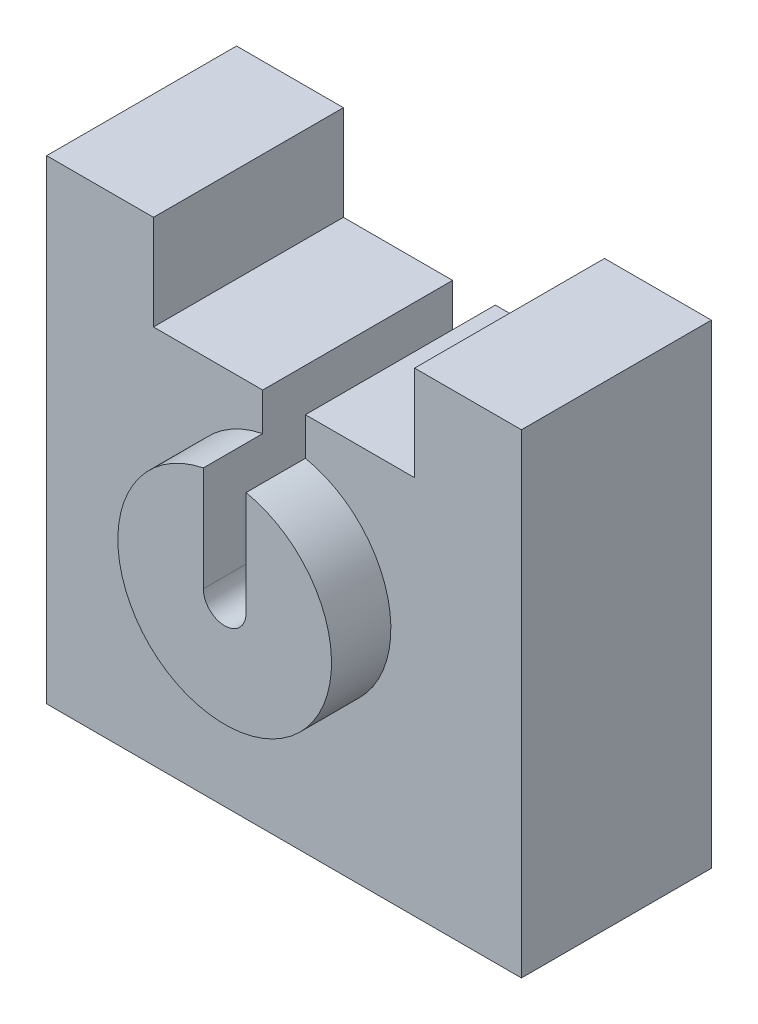
ISO-10303-21;
HEADER;
FILE_DESCRIPTION(('STEP AP214'),'2;1');
FILE_NAME('part.step','',(''),(''),'','','');
FILE_SCHEMA(('AUTOMOTIVE_DESIGN { 1 0 10303 214 1 1 1 1 }'));
ENDSEC;
DATA;
#1=APPLICATION_CONTEXT('core data for automotive mechanical design processes');
#2=APPLICATION_PROTOCOL_DEFINITION('international standard','automotive_design',2000,#1);
#3=PRODUCT_CONTEXT('',#1,'mechanical');
#4=PRODUCT('Part','Part','',(#3));
#5=PRODUCT_RELATED_PRODUCT_CATEGORY('part','',(#4));
#6=PRODUCT_DEFINITION_FORMATION('','',#4);
#7=PRODUCT_DEFINITION_CONTEXT('part definition',#1,'design');
#8=PRODUCT_DEFINITION('design','',#6,#7);
#9=PRODUCT_DEFINITION_SHAPE('','',#8);
#10=(LENGTH_UNIT() NAMED_UNIT(*) SI_UNIT(.MILLI.,.METRE.));
#11=(NAMED_UNIT(*) PLANE_ANGLE_UNIT() SI_UNIT($,.RADIAN.));
#12=(NAMED_UNIT(*) SI_UNIT($,.STERADIAN.) SOLID_ANGLE_UNIT());
#13=UNCERTAINTY_MEASURE_WITH_UNIT(LENGTH_MEASURE(1.E-05),#10,'distance_accuracy_value','');
#14=(GEOMETRIC_REPRESENTATION_CONTEXT(3) GLOBAL_UNCERTAINTY_ASSIGNED_CONTEXT((#13)) GLOBAL_UNIT_ASSIGNED_CONTEXT((#10,
#11,#12)) REPRESENTATION_CONTEXT('',''));
#15=CARTESIAN_POINT('',(0.,0.,0.));
#16=DIRECTION('',(0.,0.,1.));
#17=DIRECTION('',(1.,0.,0.));
#18=AXIS2_PLACEMENT_3D('',#15,#16,#17);
#19=CARTESIAN_POINT('',(0.275,0.3,0.4));
#20=DIRECTION('',(0.,-1.,0.));
#21=DIRECTION('',(1.,0.,0.));
#22=AXIS2_PLACEMENT_3D('',#19,#20,#21);
#23=PLANE('',#22);
#24=DIRECTION('',(-1.,0.,0.));
#25=VECTOR('',#24,1.);
#26=CARTESIAN_POINT('',(0.275,0.3,0.4));
#27=LINE('',#26,#25);
#28=CARTESIAN_POINT('',(-0.045,0.3,0.4));
#29=VERTEX_POINT('',#28);
#30=CARTESIAN_POINT('',(-0.275,0.3,0.4));
#31=VERTEX_POINT('',#30);
#32=EDGE_CURVE('E170',#29,#31,#27,.T.);
#33=ORIENTED_EDGE('',*,*,#32,.F.);
#34=DIRECTION('',(0.,0.,-1.));
#35=VECTOR('',#34,1.);
#36=CARTESIAN_POINT('',(-0.045,0.3,0.4));
#37=LINE('',#36,#35);
#38=CARTESIAN_POINT('',(-0.045,0.3,0.));
#39=VERTEX_POINT('',#38);
#40=EDGE_CURVE('E154',#29,#39,#37,.T.);
#41=ORIENTED_EDGE('',*,*,#40,.T.);
#42=DIRECTION('',(-1.,0.,0.));
#43=VECTOR('',#42,1.);
#44=CARTESIAN_POINT('',(0.275,0.3,0.));
#45=LINE('',#44,#43);
#46=CARTESIAN_POINT('',(-0.275,0.3,0.));
#47=VERTEX_POINT('',#46);
#48=EDGE_CURVE('E189',#39,#47,#45,.T.);
#49=ORIENTED_EDGE('',*,*,#48,.T.);
#50=DIRECTION('',(0.,0.,-1.));
#51=VECTOR('',#50,1.);
#52=CARTESIAN_POINT('',(-0.275,0.3,0.4));
#53=LINE('',#52,#51);
#54=EDGE_CURVE('E211',#31,#47,#53,.T.);
#55=ORIENTED_EDGE('',*,*,#54,.F.);
#56=EDGE_LOOP('',(#33,#41,#49,#55));
#57=FACE_BOUND('',#56,.T.);
#58=ADVANCED_FACE('F32',(#57),#23,.F.);
#59=CARTESIAN_POINT('',(0.,0.,0.));
#60=DIRECTION('',(0.,0.,-1.));
#61=DIRECTION('',(-1.,0.,0.));
#62=AXIS2_PLACEMENT_3D('',#59,#60,#61);
#63=PLANE('',#62);
#64=DIRECTION('',(0.,1.,0.));
#65=VECTOR('',#64,1.);
#66=CARTESIAN_POINT('',(-0.045,0.,0.));
#67=LINE('',#66,#65);
#68=CARTESIAN_POINT('',(-0.045,0.,0.));
#69=VERTEX_POINT('',#68);
#70=EDGE_CURVE('E279',#69,#39,#67,.T.);
#71=ORIENTED_EDGE('',*,*,#70,.F.);
#72=CARTESIAN_POINT('',(0.,0.,0.));
#73=DIRECTION('',(0.,0.,1.));
#74=DIRECTION('',(1.,0.,0.));
#75=AXIS2_PLACEMENT_3D('',#72,#73,#74);
#76=CIRCLE('',#75,0.045);
#77=CARTESIAN_POINT('',(0.045,0.,0.));
#78=VERTEX_POINT('',#77);
#79=EDGE_CURVE('E150',#69,#78,#76,.T.);
#80=ORIENTED_EDGE('',*,*,#79,.T.);
#81=DIRECTION('',(0.,-1.,0.));
#82=VECTOR('',#81,1.);
#83=CARTESIAN_POINT('',(0.045,0.,0.));
#84=LINE('',#83,#82);
#85=CARTESIAN_POINT('',(0.045,0.3,0.));
#86=VERTEX_POINT('',#85);
#87=EDGE_CURVE('E47',#86,#78,#84,.T.);
#88=ORIENTED_EDGE('',*,*,#87,.F.);
#89=CARTESIAN_POINT('',(0.275,0.3,0.));
#90=VERTEX_POINT('',#89);
#91=EDGE_CURVE('E190',#90,#86,#45,.T.);
#92=ORIENTED_EDGE('',*,*,#91,.F.);
#93=DIRECTION('',(0.,-1.,0.));
#94=VECTOR('',#93,1.);
#95=CARTESIAN_POINT('',(0.275,0.5,0.));
#96=LINE('',#95,#94);
#97=CARTESIAN_POINT('',(0.275,0.5,0.));
#98=VERTEX_POINT('',#97);
#99=EDGE_CURVE('E187',#98,#90,#96,.T.);
#100=ORIENTED_EDGE('',*,*,#99,.F.);
#101=DIRECTION('',(-1.,0.,0.));
#102=VECTOR('',#101,1.);
#103=CARTESIAN_POINT('',(0.275,0.5,0.));
#104=LINE('',#103,#102);
#105=CARTESIAN_POINT('',(0.5,0.5,0.));
#106=VERTEX_POINT('',#105);
#107=EDGE_CURVE('E185',#106,#98,#104,.T.);
#108=ORIENTED_EDGE('',*,*,#107,.F.);
#109=DIRECTION('',(0.,1.,0.));
#110=VECTOR('',#109,1.);
#111=CARTESIAN_POINT('',(0.5,-0.5,0.));
#112=LINE('',#111,#110);
#113=CARTESIAN_POINT('',(0.5,-0.5,0.));
#114=VERTEX_POINT('',#113);
#115=EDGE_CURVE('E161',#114,#106,#112,.T.);
#116=ORIENTED_EDGE('',*,*,#115,.F.);
#117=DIRECTION('',(1.,0.,0.));
#118=VECTOR('',#117,1.);
#119=CARTESIAN_POINT('',(-0.5,-0.5,0.));
#120=LINE('',#119,#118);
#121=CARTESIAN_POINT('',(-0.5,-0.5,0.));
#122=VERTEX_POINT('',#121);
#123=EDGE_CURVE('E166',#122,#114,#120,.T.);
#124=ORIENTED_EDGE('',*,*,#123,.F.);
#125=DIRECTION('',(0.,-1.,0.));
#126=VECTOR('',#125,1.);
#127=CARTESIAN_POINT('',(-0.5,-0.5,0.));
#128=LINE('',#127,#126);
#129=CARTESIAN_POINT('',(-0.5,0.5,0.));
#130=VERTEX_POINT('',#129);
#131=EDGE_CURVE('E197',#130,#122,#128,.T.);
#132=ORIENTED_EDGE('',*,*,#131,.F.);
#133=DIRECTION('',(-1.,0.,0.));
#134=VECTOR('',#133,1.);
#135=CARTESIAN_POINT('',(-0.5,0.5,0.));
#136=LINE('',#135,#134);
#137=CARTESIAN_POINT('',(-0.275,0.5,0.));
#138=VERTEX_POINT('',#137);
#139=EDGE_CURVE('E195',#138,#130,#136,.T.);
#140=ORIENTED_EDGE('',*,*,#139,.F.);
#141=DIRECTION('',(0.,1.,0.));
#142=VECTOR('',#141,1.);
#143=CARTESIAN_POINT('',(-0.275,0.5,0.));
#144=LINE('',#143,#142);
#145=EDGE_CURVE('E193',#47,#138,#144,.T.);
#146=ORIENTED_EDGE('',*,*,#145,.F.);
#147=ORIENTED_EDGE('',*,*,#48,.F.);
#148=EDGE_LOOP('',(#71,#80,#88,#92,#100,#108,#116,#124,#132,#140,#146,#147));
#149=FACE_BOUND('',#148,.T.);
#150=ADVANCED_FACE('F227',(#149),#63,.T.);
#151=CARTESIAN_POINT('',(0.,0.,0.525));
#152=DIRECTION('',(0.,0.,-1.));
#153=DIRECTION('',(-1.,0.,0.));
#154=AXIS2_PLACEMENT_3D('',#151,#152,#153);
#155=PLANE('',#154);
#156=CARTESIAN_POINT('',(0.,0.,0.525));
#157=DIRECTION('',(0.,0.,1.));
#158=DIRECTION('',(1.,0.,0.));
#159=AXIS2_PLACEMENT_3D('',#156,#157,#158);
#160=CIRCLE('',#159,0.045);
#161=CARTESIAN_POINT('',(-0.045,0.,0.525));
#162=VERTEX_POINT('',#161);
#163=CARTESIAN_POINT('',(0.045,0.,0.525));
#164=VERTEX_POINT('',#163);
#165=EDGE_CURVE('E145',#162,#164,#160,.T.);
#166=ORIENTED_EDGE('',*,*,#165,.F.);
#167=DIRECTION('',(0.,1.,0.));
#168=VECTOR('',#167,1.);
#169=CARTESIAN_POINT('',(-0.045,0.,0.525));
#170=LINE('',#169,#168);
#171=CARTESIAN_POINT('',(-0.045,0.220454076850486,0.525));
#172=VERTEX_POINT('',#171);
#173=EDGE_CURVE('E55',#162,#172,#170,.T.);
#174=ORIENTED_EDGE('',*,*,#173,.T.);
#175=CARTESIAN_POINT('',(0.,0.,0.525));
#176=DIRECTION('',(0.,0.,-1.));
#177=DIRECTION('',(-1.,0.,0.));
#178=AXIS2_PLACEMENT_3D('',#175,#176,#177);
#179=CIRCLE('',#178,0.225);
#180=CARTESIAN_POINT('',(0.045,0.220454076850486,0.525));
#181=VERTEX_POINT('',#180);
#182=EDGE_CURVE('E147',#181,#172,#179,.T.);
#183=ORIENTED_EDGE('',*,*,#182,.F.);
#184=DIRECTION('',(0.,-1.,0.));
#185=VECTOR('',#184,1.);
#186=CARTESIAN_POINT('',(0.045,0.,0.525));
#187=LINE('',#186,#185);
#188=EDGE_CURVE('E133',#181,#164,#187,.T.);
#189=ORIENTED_EDGE('',*,*,#188,.T.);
#190=EDGE_LOOP('',(#166,#174,#183,#189));
#191=FACE_BOUND('',#190,.T.);
#192=ADVANCED_FACE('F144',(#191),#155,.F.);
#193=CARTESIAN_POINT('',(0.5,-0.5,0.4));
#194=DIRECTION('',(-1.,0.,0.));
#195=DIRECTION('',(0.,0.,1.));
#196=AXIS2_PLACEMENT_3D('',#193,#194,#195);
#197=PLANE('',#196);
#198=ORIENTED_EDGE('',*,*,#115,.T.);
#199=DIRECTION('',(0.,0.,-1.));
#200=VECTOR('',#199,1.);
#201=CARTESIAN_POINT('',(0.5,0.5,0.4));
#202=LINE('',#201,#200);
#203=CARTESIAN_POINT('',(0.5,0.5,0.4));
#204=VERTEX_POINT('',#203);
#205=EDGE_CURVE('E11',#204,#106,#202,.T.);
#206=ORIENTED_EDGE('',*,*,#205,.F.);
#207=DIRECTION('',(0.,1.,0.));
#208=VECTOR('',#207,1.);
#209=CARTESIAN_POINT('',(0.5,-0.5,0.4));
#210=LINE('',#209,#208);
#211=CARTESIAN_POINT('',(0.5,-0.5,0.4));
#212=VERTEX_POINT('',#211);
#213=EDGE_CURVE('E162',#212,#204,#210,.T.);
#214=ORIENTED_EDGE('',*,*,#213,.F.);
#215=DIRECTION('',(0.,0.,-1.));
#216=VECTOR('',#215,1.);
#217=CARTESIAN_POINT('',(0.5,-0.5,0.4));
#218=LINE('',#217,#216);
#219=EDGE_CURVE('E182',#212,#114,#218,.T.);
#220=ORIENTED_EDGE('',*,*,#219,.T.);
#221=EDGE_LOOP('',(#198,#206,#214,#220));
#222=FACE_BOUND('',#221,.T.);
#223=ADVANCED_FACE('F34',(#222),#197,.F.);
#224=CARTESIAN_POINT('',(0.275,0.5,0.4));
#225=DIRECTION('',(0.,-1.,0.));
#226=DIRECTION('',(0.,0.,-1.));
#227=AXIS2_PLACEMENT_3D('',#224,#225,#226);
#228=PLANE('',#227);
#229=ORIENTED_EDGE('',*,*,#107,.T.);
#230=DIRECTION('',(0.,0.,-1.));
#231=VECTOR('',#230,1.);
#232=CARTESIAN_POINT('',(0.275,0.5,0.4));
#233=LINE('',#232,#231);
#234=CARTESIAN_POINT('',(0.275,0.5,0.4));
#235=VERTEX_POINT('',#234);
#236=EDGE_CURVE('E40',#235,#98,#233,.T.);
#237=ORIENTED_EDGE('',*,*,#236,.F.);
#238=DIRECTION('',(-1.,0.,0.));
#239=VECTOR('',#238,1.);
#240=CARTESIAN_POINT('',(0.275,0.5,0.4));
#241=LINE('',#240,#239);
#242=EDGE_CURVE('E165',#204,#235,#241,.T.);
#243=ORIENTED_EDGE('',*,*,#242,.F.);
#244=ORIENTED_EDGE('',*,*,#205,.T.);
#245=EDGE_LOOP('',(#229,#237,#243,#244));
#246=FACE_BOUND('',#245,.T.);
#247=ADVANCED_FACE('F241',(#246),#228,.F.);
#248=CARTESIAN_POINT('',(0.275,0.5,0.4));
#249=DIRECTION('',(1.,0.,0.));
#250=DIRECTION('',(0.,1.,0.));
#251=AXIS2_PLACEMENT_3D('',#248,#249,#250);
#252=PLANE('',#251);
#253=ORIENTED_EDGE('',*,*,#99,.T.);
#254=DIRECTION('',(0.,0.,-1.));
#255=VECTOR('',#254,1.);
#256=CARTESIAN_POINT('',(0.275,0.3,0.4));
#257=LINE('',#256,#255);
#258=CARTESIAN_POINT('',(0.275,0.3,0.4));
#259=VERTEX_POINT('',#258);
#260=EDGE_CURVE('E214',#259,#90,#257,.T.);
#261=ORIENTED_EDGE('',*,*,#260,.F.);
#262=DIRECTION('',(0.,-1.,0.));
#263=VECTOR('',#262,1.);
#264=CARTESIAN_POINT('',(0.275,0.5,0.4));
#265=LINE('',#264,#263);
#266=EDGE_CURVE('E168',#235,#259,#265,.T.);
#267=ORIENTED_EDGE('',*,*,#266,.F.);
#268=ORIENTED_EDGE('',*,*,#236,.T.);
#269=EDGE_LOOP('',(#253,#261,#267,#268));
#270=FACE_BOUND('',#269,.T.);
#271=ADVANCED_FACE('F221',(#270),#252,.F.);
#272=ORIENTED_EDGE('',*,*,#91,.T.);
#273=DIRECTION('',(0.,0.,1.));
#274=VECTOR('',#273,1.);
#275=CARTESIAN_POINT('',(0.045,0.3,0.4));
#276=LINE('',#275,#274);
#277=CARTESIAN_POINT('',(0.045,0.3,0.4));
#278=VERTEX_POINT('',#277);
#279=EDGE_CURVE('E233',#86,#278,#276,.T.);
#280=ORIENTED_EDGE('',*,*,#279,.T.);
#281=EDGE_CURVE('E171',#259,#278,#27,.T.);
#282=ORIENTED_EDGE('',*,*,#281,.F.);
#283=ORIENTED_EDGE('',*,*,#260,.T.);
#284=EDGE_LOOP('',(#272,#280,#282,#283));
#285=FACE_BOUND('',#284,.T.);
#286=ADVANCED_FACE('F231',(#285),#23,.F.);
#287=CARTESIAN_POINT('',(-0.275,0.5,0.4));
#288=DIRECTION('',(-1.,0.,0.));
#289=DIRECTION('',(0.,-1.,0.));
#290=AXIS2_PLACEMENT_3D('',#287,#288,#289);
#291=PLANE('',#290);
#292=ORIENTED_EDGE('',*,*,#145,.T.);
#293=DIRECTION('',(0.,0.,-1.));
#294=VECTOR('',#293,1.);
#295=CARTESIAN_POINT('',(-0.275,0.5,0.4));
#296=LINE('',#295,#294);
#297=CARTESIAN_POINT('',(-0.275,0.5,0.4));
#298=VERTEX_POINT('',#297);
#299=EDGE_CURVE('E208',#298,#138,#296,.T.);
#300=ORIENTED_EDGE('',*,*,#299,.F.);
#301=DIRECTION('',(0.,1.,0.));
#302=VECTOR('',#301,1.);
#303=CARTESIAN_POINT('',(-0.275,0.5,0.4));
#304=LINE('',#303,#302);
#305=EDGE_CURVE('E174',#31,#298,#304,.T.);
#306=ORIENTED_EDGE('',*,*,#305,.F.);
#307=ORIENTED_EDGE('',*,*,#54,.T.);
#308=EDGE_LOOP('',(#292,#300,#306,#307));
#309=FACE_BOUND('',#308,.T.);
#310=ADVANCED_FACE('F262',(#309),#291,.F.);
#311=CARTESIAN_POINT('',(-0.5,0.5,0.4));
#312=DIRECTION('',(0.,-1.,0.));
#313=DIRECTION('',(1.,0.,0.));
#314=AXIS2_PLACEMENT_3D('',#311,#312,#313);
#315=PLANE('',#314);
#316=ORIENTED_EDGE('',*,*,#139,.T.);
#317=DIRECTION('',(0.,0.,-1.));
#318=VECTOR('',#317,1.);
#319=CARTESIAN_POINT('',(-0.5,0.5,0.4));
#320=LINE('',#319,#318);
#321=CARTESIAN_POINT('',(-0.5,0.5,0.4));
#322=VERTEX_POINT('',#321);
#323=EDGE_CURVE('E205',#322,#130,#320,.T.);
#324=ORIENTED_EDGE('',*,*,#323,.F.);
#325=DIRECTION('',(-1.,0.,0.));
#326=VECTOR('',#325,1.);
#327=CARTESIAN_POINT('',(-0.5,0.5,0.4));
#328=LINE('',#327,#326);
#329=EDGE_CURVE('E176',#298,#322,#328,.T.);
#330=ORIENTED_EDGE('',*,*,#329,.F.);
#331=ORIENTED_EDGE('',*,*,#299,.T.);
#332=EDGE_LOOP('',(#316,#324,#330,#331));
#333=FACE_BOUND('',#332,.T.);
#334=ADVANCED_FACE('F257',(#333),#315,.F.);
#335=CARTESIAN_POINT('',(-0.5,-0.5,0.4));
#336=DIRECTION('',(1.,0.,0.));
#337=DIRECTION('',(0.,0.,-1.));
#338=AXIS2_PLACEMENT_3D('',#335,#336,#337);
#339=PLANE('',#338);
#340=ORIENTED_EDGE('',*,*,#131,.T.);
#341=DIRECTION('',(0.,0.,-1.));
#342=VECTOR('',#341,1.);
#343=CARTESIAN_POINT('',(-0.5,-0.5,0.4));
#344=LINE('',#343,#342);
#345=CARTESIAN_POINT('',(-0.5,-0.5,0.4));
#346=VERTEX_POINT('',#345);
#347=EDGE_CURVE('E202',#346,#122,#344,.T.);
#348=ORIENTED_EDGE('',*,*,#347,.F.);
#349=DIRECTION('',(0.,-1.,0.));
#350=VECTOR('',#349,1.);
#351=CARTESIAN_POINT('',(-0.5,-0.5,0.4));
#352=LINE('',#351,#350);
#353=EDGE_CURVE('E178',#322,#346,#352,.T.);
#354=ORIENTED_EDGE('',*,*,#353,.F.);
#355=ORIENTED_EDGE('',*,*,#323,.T.);
#356=EDGE_LOOP('',(#340,#348,#354,#355));
#357=FACE_BOUND('',#356,.T.);
#358=ADVANCED_FACE('F253',(#357),#339,.F.);
#359=CARTESIAN_POINT('',(-0.5,-0.5,0.4));
#360=DIRECTION('',(0.,1.,0.));
#361=DIRECTION('',(0.,0.,1.));
#362=AXIS2_PLACEMENT_3D('',#359,#360,#361);
#363=PLANE('',#362);
#364=ORIENTED_EDGE('',*,*,#123,.T.);
#365=ORIENTED_EDGE('',*,*,#219,.F.);
#366=DIRECTION('',(1.,0.,0.));
#367=VECTOR('',#366,1.);
#368=CARTESIAN_POINT('',(-0.5,-0.5,0.4));
#369=LINE('',#368,#367);
#370=EDGE_CURVE('E180',#346,#212,#369,.T.);
#371=ORIENTED_EDGE('',*,*,#370,.F.);
#372=ORIENTED_EDGE('',*,*,#347,.T.);
#373=EDGE_LOOP('',(#364,#365,#371,#372));
#374=FACE_BOUND('',#373,.T.);
#375=ADVANCED_FACE('F248',(#374),#363,.F.);
#376=CARTESIAN_POINT('',(0.,0.,0.4));
#377=DIRECTION('',(0.,0.,-1.));
#378=DIRECTION('',(-1.,0.,0.));
#379=AXIS2_PLACEMENT_3D('',#376,#377,#378);
#380=PLANE('',#379);
#381=CARTESIAN_POINT('',(0.,0.,0.4));
#382=DIRECTION('',(0.,0.,-1.));
#383=DIRECTION('',(-1.,0.,0.));
#384=AXIS2_PLACEMENT_3D('',#381,#382,#383);
#385=CIRCLE('',#384,0.225);
#386=CARTESIAN_POINT('',(0.045,0.220454076850486,0.4));
#387=VERTEX_POINT('',#386);
#388=CARTESIAN_POINT('',(-0.045,0.220454076850486,0.4));
#389=VERTEX_POINT('',#388);
#390=EDGE_CURVE('E152',#387,#389,#385,.T.);
#391=ORIENTED_EDGE('',*,*,#390,.T.);
#392=DIRECTION('',(0.,1.,0.));
#393=VECTOR('',#392,1.);
#394=CARTESIAN_POINT('',(-0.045,0.,0.4));
#395=LINE('',#394,#393);
#396=EDGE_CURVE('E269',#389,#29,#395,.T.);
#397=ORIENTED_EDGE('',*,*,#396,.T.);
#398=ORIENTED_EDGE('',*,*,#32,.T.);
#399=ORIENTED_EDGE('',*,*,#305,.T.);
#400=ORIENTED_EDGE('',*,*,#329,.T.);
#401=ORIENTED_EDGE('',*,*,#353,.T.);
#402=ORIENTED_EDGE('',*,*,#370,.T.);
#403=ORIENTED_EDGE('',*,*,#213,.T.);
#404=ORIENTED_EDGE('',*,*,#242,.T.);
#405=ORIENTED_EDGE('',*,*,#266,.T.);
#406=ORIENTED_EDGE('',*,*,#281,.T.);
#407=DIRECTION('',(0.,-1.,0.));
#408=VECTOR('',#407,1.);
#409=CARTESIAN_POINT('',(0.045,0.,0.4));
#410=LINE('',#409,#408);
#411=EDGE_CURVE('E237',#278,#387,#410,.T.);
#412=ORIENTED_EDGE('',*,*,#411,.T.);
#413=EDGE_LOOP('',(#391,#397,#398,#399,#400,#401,#402,#403,#404,#405,#406,#412));
#414=FACE_BOUND('',#413,.T.);
#415=ADVANCED_FACE('F236',(#414),#380,.F.);
#416=CARTESIAN_POINT('',(0.,0.,0.525));
#417=DIRECTION('',(0.,0.,-1.));
#418=DIRECTION('',(-1.,0.,0.));
#419=AXIS2_PLACEMENT_3D('',#416,#417,#418);
#420=CYLINDRICAL_SURFACE('',#419,0.225);
#421=DIRECTION('',(0.,0.,-1.));
#422=VECTOR('',#421,1.);
#423=CARTESIAN_POINT('',(-0.045,0.220454076850486,0.525));
#424=LINE('',#423,#422);
#425=EDGE_CURVE('E270',#389,#172,#424,.F.);
#426=ORIENTED_EDGE('',*,*,#425,.F.);
#427=ORIENTED_EDGE('',*,*,#390,.F.);
#428=DIRECTION('',(0.,0.,-1.));
#429=VECTOR('',#428,1.);
#430=CARTESIAN_POINT('',(0.045,0.220454076850486,0.525));
#431=LINE('',#430,#429);
#432=EDGE_CURVE('E275',#181,#387,#431,.T.);
#433=ORIENTED_EDGE('',*,*,#432,.F.);
#434=ORIENTED_EDGE('',*,*,#182,.T.);
#435=EDGE_LOOP('',(#426,#427,#433,#434));
#436=FACE_BOUND('',#435,.T.);
#437=ADVANCED_FACE('F283',(#436),#420,.T.);
#438=CARTESIAN_POINT('',(0.,0.,0.525));
#439=DIRECTION('',(0.,0.,-1.));
#440=DIRECTION('',(-1.,0.,0.));
#441=AXIS2_PLACEMENT_3D('',#438,#439,#440);
#442=CYLINDRICAL_SURFACE('',#441,0.045);
#443=DIRECTION('',(0.,0.,-1.));
#444=VECTOR('',#443,1.);
#445=CARTESIAN_POINT('',(-0.045,0.,0.525));
#446=LINE('',#445,#444);
#447=EDGE_CURVE('E139',#162,#69,#446,.T.);
#448=ORIENTED_EDGE('',*,*,#447,.F.);
#449=ORIENTED_EDGE('',*,*,#165,.T.);
#450=DIRECTION('',(0.,0.,-1.));
#451=VECTOR('',#450,1.);
#452=CARTESIAN_POINT('',(0.045,0.,0.525));
#453=LINE('',#452,#451);
#454=EDGE_CURVE('E130',#164,#78,#453,.T.);
#455=ORIENTED_EDGE('',*,*,#454,.T.);
#456=ORIENTED_EDGE('',*,*,#79,.F.);
#457=EDGE_LOOP('',(#448,#449,#455,#456));
#458=FACE_BOUND('',#457,.T.);
#459=ADVANCED_FACE('F149',(#458),#442,.F.);
#460=CARTESIAN_POINT('',(0.045,0.,0.525));
#461=DIRECTION('',(1.,0.,0.));
#462=DIRECTION('',(0.,0.,-1.));
#463=AXIS2_PLACEMENT_3D('',#460,#461,#462);
#464=PLANE('',#463);
#465=ORIENTED_EDGE('',*,*,#87,.T.);
#466=ORIENTED_EDGE('',*,*,#454,.F.);
#467=ORIENTED_EDGE('',*,*,#188,.F.);
#468=ORIENTED_EDGE('',*,*,#432,.T.);
#469=ORIENTED_EDGE('',*,*,#411,.F.);
#470=ORIENTED_EDGE('',*,*,#279,.F.);
#471=EDGE_LOOP('',(#465,#466,#467,#468,#469,#470));
#472=FACE_BOUND('',#471,.T.);
#473=ADVANCED_FACE('F132',(#472),#464,.F.);
#474=CARTESIAN_POINT('',(-0.045,0.,0.525));
#475=DIRECTION('',(-1.,0.,0.));
#476=DIRECTION('',(0.,0.,1.));
#477=AXIS2_PLACEMENT_3D('',#474,#475,#476);
#478=PLANE('',#477);
#479=ORIENTED_EDGE('',*,*,#396,.F.);
#480=ORIENTED_EDGE('',*,*,#425,.T.);
#481=ORIENTED_EDGE('',*,*,#173,.F.);
#482=ORIENTED_EDGE('',*,*,#447,.T.);
#483=ORIENTED_EDGE('',*,*,#70,.T.);
#484=ORIENTED_EDGE('',*,*,#40,.F.);
#485=EDGE_LOOP('',(#479,#480,#481,#482,#483,#484));
#486=FACE_BOUND('',#485,.T.);
#487=ADVANCED_FACE('F284',(#486),#478,.F.);
#488=CLOSED_SHELL('',(#58,#150,#192,#223,#247,#271,#286,#310,#334,#358,#375,#415,#437,#459,#473,#487));
#489=MANIFOLD_SOLID_BREP('B2',#488);
#490=ADVANCED_BREP_SHAPE_REPRESENTATION('',(#18,#489),#14);
#491=SHAPE_DEFINITION_REPRESENTATION(#9,#490);
ENDSEC;
END-ISO-10303-21;
